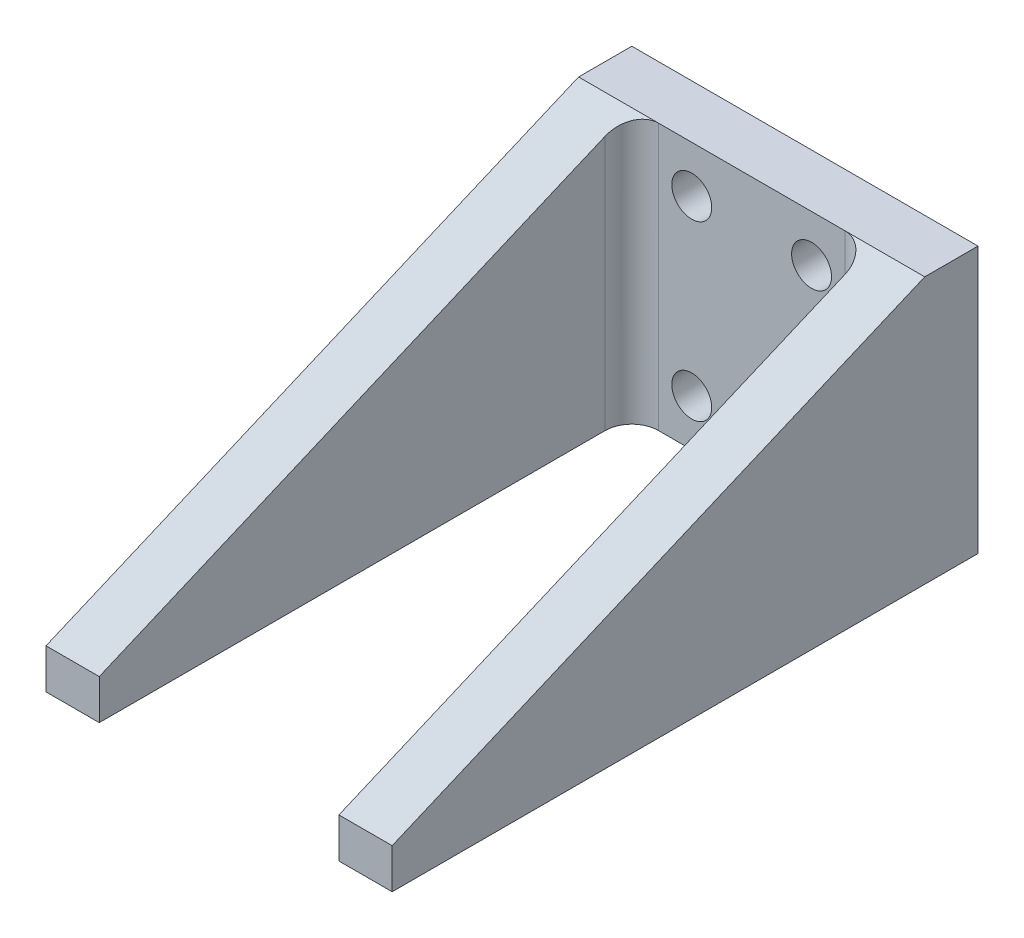
ISO-10303-21;
HEADER;
FILE_DESCRIPTION(('STEP AP214'),'2;1');
FILE_NAME('part.step','',(''),(''),'','','');
FILE_SCHEMA(('AUTOMOTIVE_DESIGN { 1 0 10303 214 1 1 1 1 }'));
ENDSEC;
DATA;
#1=APPLICATION_CONTEXT('core data for automotive mechanical design processes');
#2=APPLICATION_PROTOCOL_DEFINITION('international standard','automotive_design',2000,#1);
#3=PRODUCT_CONTEXT('',#1,'mechanical');
#4=PRODUCT('Part','Part','',(#3));
#5=PRODUCT_RELATED_PRODUCT_CATEGORY('part','',(#4));
#6=PRODUCT_DEFINITION_FORMATION('','',#4);
#7=PRODUCT_DEFINITION_CONTEXT('part definition',#1,'design');
#8=PRODUCT_DEFINITION('design','',#6,#7);
#9=PRODUCT_DEFINITION_SHAPE('','',#8);
#10=(LENGTH_UNIT() NAMED_UNIT(*) SI_UNIT(.MILLI.,.METRE.));
#11=(NAMED_UNIT(*) PLANE_ANGLE_UNIT() SI_UNIT($,.RADIAN.));
#12=(NAMED_UNIT(*) SI_UNIT($,.STERADIAN.) SOLID_ANGLE_UNIT());
#13=UNCERTAINTY_MEASURE_WITH_UNIT(LENGTH_MEASURE(1.E-05),#10,'distance_accuracy_value','');
#14=(GEOMETRIC_REPRESENTATION_CONTEXT(3) GLOBAL_UNCERTAINTY_ASSIGNED_CONTEXT((#13)) GLOBAL_UNIT_ASSIGNED_CONTEXT((#10,
#11,#12)) REPRESENTATION_CONTEXT('',''));
#15=CARTESIAN_POINT('',(0.,0.,0.));
#16=DIRECTION('',(0.,0.,1.));
#17=DIRECTION('',(1.,0.,0.));
#18=AXIS2_PLACEMENT_3D('',#15,#16,#17);
#19=CARTESIAN_POINT('',(0.,0.,4.));
#20=DIRECTION('',(0.,0.,-1.));
#21=DIRECTION('',(-1.,0.,0.));
#22=AXIS2_PLACEMENT_3D('',#19,#20,#21);
#23=PLANE('',#22);
#24=CARTESIAN_POINT('',(-4.5,-6.5,4.));
#25=DIRECTION('',(0.,0.,1.));
#26=DIRECTION('',(1.,0.,0.));
#27=AXIS2_PLACEMENT_3D('',#24,#25,#26);
#28=CIRCLE('',#27,1.5);
#29=CARTESIAN_POINT('',(-3.,-6.5,4.));
#30=VERTEX_POINT('',#29);
#31=EDGE_CURVE('E204',#30,#30,#28,.T.);
#32=ORIENTED_EDGE('',*,*,#31,.F.);
#33=EDGE_LOOP('',(#32));
#34=FACE_BOUND('',#33,.T.);
#35=CARTESIAN_POINT('',(4.5,-6.5,4.));
#36=DIRECTION('',(0.,0.,1.));
#37=DIRECTION('',(1.,0.,0.));
#38=AXIS2_PLACEMENT_3D('',#35,#36,#37);
#39=CIRCLE('',#38,1.5);
#40=CARTESIAN_POINT('',(6.,-6.5,4.));
#41=VERTEX_POINT('',#40);
#42=EDGE_CURVE('E211',#41,#41,#39,.T.);
#43=ORIENTED_EDGE('',*,*,#42,.F.);
#44=EDGE_LOOP('',(#43));
#45=FACE_BOUND('',#44,.T.);
#46=CARTESIAN_POINT('',(4.5,6.5,4.));
#47=DIRECTION('',(0.,0.,1.));
#48=DIRECTION('',(1.,0.,0.));
#49=AXIS2_PLACEMENT_3D('',#46,#47,#48);
#50=CIRCLE('',#49,1.5);
#51=CARTESIAN_POINT('',(6.,6.5,4.));
#52=VERTEX_POINT('',#51);
#53=EDGE_CURVE('E208',#52,#52,#50,.T.);
#54=ORIENTED_EDGE('',*,*,#53,.F.);
#55=EDGE_LOOP('',(#54));
#56=FACE_BOUND('',#55,.T.);
#57=CARTESIAN_POINT('',(-4.5,6.5,4.));
#58=DIRECTION('',(0.,0.,1.));
#59=DIRECTION('',(1.,0.,0.));
#60=AXIS2_PLACEMENT_3D('',#57,#58,#59);
#61=CIRCLE('',#60,1.5);
#62=CARTESIAN_POINT('',(-3.,6.5,4.));
#63=VERTEX_POINT('',#62);
#64=EDGE_CURVE('E151',#63,#63,#61,.T.);
#65=ORIENTED_EDGE('',*,*,#64,.F.);
#66=EDGE_LOOP('',(#65));
#67=FACE_BOUND('',#66,.T.);
#68=DIRECTION('',(-1.,0.,0.));
#69=VECTOR('',#68,1.);
#70=CARTESIAN_POINT('',(-13.,10.,4.));
#71=LINE('',#70,#69);
#72=CARTESIAN_POINT('',(6.99999999999999,10.,4.));
#73=VERTEX_POINT('',#72);
#74=CARTESIAN_POINT('',(-7.,10.,4.));
#75=VERTEX_POINT('',#74);
#76=EDGE_CURVE('E190',#73,#75,#71,.T.);
#77=ORIENTED_EDGE('',*,*,#76,.T.);
#78=DIRECTION('',(0.,1.,0.));
#79=VECTOR('',#78,1.);
#80=CARTESIAN_POINT('',(-6.99999999999999,-10.,4.));
#81=LINE('',#80,#79);
#82=CARTESIAN_POINT('',(-7.,-10.,4.));
#83=VERTEX_POINT('',#82);
#84=EDGE_CURVE('E169',#75,#83,#81,.F.);
#85=ORIENTED_EDGE('',*,*,#84,.T.);
#86=DIRECTION('',(1.,0.,0.));
#87=VECTOR('',#86,1.);
#88=CARTESIAN_POINT('',(-13.,-10.,4.));
#89=LINE('',#88,#87);
#90=CARTESIAN_POINT('',(7.,-10.,4.));
#91=VERTEX_POINT('',#90);
#92=EDGE_CURVE('E181',#83,#91,#89,.T.);
#93=ORIENTED_EDGE('',*,*,#92,.T.);
#94=DIRECTION('',(0.,-1.,0.));
#95=VECTOR('',#94,1.);
#96=CARTESIAN_POINT('',(7.,10.,4.));
#97=LINE('',#96,#95);
#98=EDGE_CURVE('E166',#91,#73,#97,.F.);
#99=ORIENTED_EDGE('',*,*,#98,.T.);
#100=EDGE_LOOP('',(#77,#85,#93,#99));
#101=FACE_BOUND('',#100,.T.);
#102=ADVANCED_FACE('F35',(#34,#45,#56,#67,#101),#23,.F.);
#103=CARTESIAN_POINT('',(13.,-10.,4.));
#104=DIRECTION('',(-1.,0.,0.));
#105=DIRECTION('',(0.,0.,1.));
#106=AXIS2_PLACEMENT_3D('',#103,#104,#105);
#107=PLANE('',#106);
#108=DIRECTION('',(0.,0.,-1.));
#109=VECTOR('',#108,1.);
#110=CARTESIAN_POINT('',(13.,10.,4.));
#111=LINE('',#110,#109);
#112=CARTESIAN_POINT('',(13.,10.,4.));
#113=VERTEX_POINT('',#112);
#114=CARTESIAN_POINT('',(13.,10.,0.));
#115=VERTEX_POINT('',#114);
#116=EDGE_CURVE('E137',#113,#115,#111,.T.);
#117=ORIENTED_EDGE('',*,*,#116,.F.);
#118=DIRECTION('',(0.,0.391140640344852,-0.920330918458474));
#119=VECTOR('',#118,1.);
#120=CARTESIAN_POINT('',(13.,-7.,44.));
#121=LINE('',#120,#119);
#122=CARTESIAN_POINT('',(13.,-7.,44.));
#123=VERTEX_POINT('',#122);
#124=EDGE_CURVE('E131',#123,#113,#121,.T.);
#125=ORIENTED_EDGE('',*,*,#124,.F.);
#126=DIRECTION('',(0.,1.,0.));
#127=VECTOR('',#126,1.);
#128=CARTESIAN_POINT('',(13.,10.,44.));
#129=LINE('',#128,#127);
#130=CARTESIAN_POINT('',(13.,-10.,44.));
#131=VERTEX_POINT('',#130);
#132=EDGE_CURVE('E160',#131,#123,#129,.T.);
#133=ORIENTED_EDGE('',*,*,#132,.F.);
#134=DIRECTION('',(0.,0.,-1.));
#135=VECTOR('',#134,1.);
#136=CARTESIAN_POINT('',(13.,-10.,4.));
#137=LINE('',#136,#135);
#138=CARTESIAN_POINT('',(13.,-10.,0.));
#139=VERTEX_POINT('',#138);
#140=EDGE_CURVE('E143',#131,#139,#137,.T.);
#141=ORIENTED_EDGE('',*,*,#140,.T.);
#142=DIRECTION('',(0.,1.,0.));
#143=VECTOR('',#142,1.);
#144=CARTESIAN_POINT('',(13.,-10.,0.));
#145=LINE('',#144,#143);
#146=EDGE_CURVE('E234',#139,#115,#145,.T.);
#147=ORIENTED_EDGE('',*,*,#146,.T.);
#148=EDGE_LOOP('',(#117,#125,#133,#141,#147));
#149=FACE_BOUND('',#148,.T.);
#150=ADVANCED_FACE('F247',(#149),#107,.F.);
#151=CARTESIAN_POINT('',(-13.,10.,4.));
#152=DIRECTION('',(0.,-1.,0.));
#153=DIRECTION('',(0.,0.,-1.));
#154=AXIS2_PLACEMENT_3D('',#151,#152,#153);
#155=PLANE('',#154);
#156=DIRECTION('',(0.,0.,-1.));
#157=VECTOR('',#156,1.);
#158=CARTESIAN_POINT('',(-13.,10.,4.));
#159=LINE('',#158,#157);
#160=CARTESIAN_POINT('',(-13.,10.,4.));
#161=VERTEX_POINT('',#160);
#162=CARTESIAN_POINT('',(-13.,10.,0.));
#163=VERTEX_POINT('',#162);
#164=EDGE_CURVE('E126',#161,#163,#159,.T.);
#165=ORIENTED_EDGE('',*,*,#164,.F.);
#166=DIRECTION('',(1.,0.,0.));
#167=VECTOR('',#166,1.);
#168=CARTESIAN_POINT('',(-13.,10.,4.));
#169=LINE('',#168,#167);
#170=EDGE_CURVE('E51',#161,#75,#169,.T.);
#171=ORIENTED_EDGE('',*,*,#170,.T.);
#172=ORIENTED_EDGE('',*,*,#76,.F.);
#173=EDGE_CURVE('E121',#73,#113,#169,.T.);
#174=ORIENTED_EDGE('',*,*,#173,.T.);
#175=ORIENTED_EDGE('',*,*,#116,.T.);
#176=DIRECTION('',(-1.,0.,0.));
#177=VECTOR('',#176,1.);
#178=CARTESIAN_POINT('',(-13.,10.,0.));
#179=LINE('',#178,#177);
#180=EDGE_CURVE('E135',#115,#163,#179,.T.);
#181=ORIENTED_EDGE('',*,*,#180,.T.);
#182=EDGE_LOOP('',(#165,#171,#172,#174,#175,#181));
#183=FACE_BOUND('',#182,.T.);
#184=ADVANCED_FACE('F133',(#183),#155,.F.);
#185=CARTESIAN_POINT('',(-13.,-10.,4.));
#186=DIRECTION('',(1.,0.,0.));
#187=DIRECTION('',(0.,0.,-1.));
#188=AXIS2_PLACEMENT_3D('',#185,#186,#187);
#189=PLANE('',#188);
#190=DIRECTION('',(0.,-1.,0.));
#191=VECTOR('',#190,1.);
#192=CARTESIAN_POINT('',(-13.,10.,44.));
#193=LINE('',#192,#191);
#194=CARTESIAN_POINT('',(-13.,-7.,44.));
#195=VERTEX_POINT('',#194);
#196=CARTESIAN_POINT('',(-13.,-10.,44.));
#197=VERTEX_POINT('',#196);
#198=EDGE_CURVE('E129',#195,#197,#193,.T.);
#199=ORIENTED_EDGE('',*,*,#198,.F.);
#200=DIRECTION('',(0.,0.391140640344852,-0.920330918458474));
#201=VECTOR('',#200,1.);
#202=CARTESIAN_POINT('',(-13.,-7.,44.));
#203=LINE('',#202,#201);
#204=EDGE_CURVE('E115',#195,#161,#203,.T.);
#205=ORIENTED_EDGE('',*,*,#204,.T.);
#206=ORIENTED_EDGE('',*,*,#164,.T.);
#207=DIRECTION('',(0.,-1.,0.));
#208=VECTOR('',#207,1.);
#209=CARTESIAN_POINT('',(-13.,-10.,0.));
#210=LINE('',#209,#208);
#211=CARTESIAN_POINT('',(-13.,-10.,0.));
#212=VERTEX_POINT('',#211);
#213=EDGE_CURVE('E240',#163,#212,#210,.T.);
#214=ORIENTED_EDGE('',*,*,#213,.T.);
#215=DIRECTION('',(0.,0.,-1.));
#216=VECTOR('',#215,1.);
#217=CARTESIAN_POINT('',(-13.,-10.,4.));
#218=LINE('',#217,#216);
#219=EDGE_CURVE('E138',#197,#212,#218,.T.);
#220=ORIENTED_EDGE('',*,*,#219,.F.);
#221=EDGE_LOOP('',(#199,#205,#206,#214,#220));
#222=FACE_BOUND('',#221,.T.);
#223=ADVANCED_FACE('F125',(#222),#189,.F.);
#224=CARTESIAN_POINT('',(-13.,-10.,4.));
#225=DIRECTION('',(0.,1.,0.));
#226=DIRECTION('',(0.,0.,1.));
#227=AXIS2_PLACEMENT_3D('',#224,#225,#226);
#228=PLANE('',#227);
#229=DIRECTION('',(1.,0.,0.));
#230=VECTOR('',#229,1.);
#231=CARTESIAN_POINT('',(-13.,-10.,0.));
#232=LINE('',#231,#230);
#233=EDGE_CURVE('E235',#212,#139,#232,.T.);
#234=ORIENTED_EDGE('',*,*,#233,.T.);
#235=ORIENTED_EDGE('',*,*,#140,.F.);
#236=DIRECTION('',(1.,0.,0.));
#237=VECTOR('',#236,1.);
#238=CARTESIAN_POINT('',(13.,-10.,44.));
#239=LINE('',#238,#237);
#240=CARTESIAN_POINT('',(9.00000000000001,-10.,44.));
#241=VERTEX_POINT('',#240);
#242=EDGE_CURVE('E221',#241,#131,#239,.T.);
#243=ORIENTED_EDGE('',*,*,#242,.F.);
#244=DIRECTION('',(0.,0.,-1.));
#245=VECTOR('',#244,1.);
#246=CARTESIAN_POINT('',(9.00000000000001,-10.,44.));
#247=LINE('',#246,#245);
#248=CARTESIAN_POINT('',(9.00000000000001,-10.,6.));
#249=VERTEX_POINT('',#248);
#250=EDGE_CURVE('E185',#241,#249,#247,.T.);
#251=ORIENTED_EDGE('',*,*,#250,.T.);
#252=CARTESIAN_POINT('',(7.,-9.99999999999999,6.));
#253=DIRECTION('',(0.,1.,0.));
#254=DIRECTION('',(0.,0.,1.));
#255=AXIS2_PLACEMENT_3D('',#252,#253,#254);
#256=CIRCLE('',#255,2.);
#257=EDGE_CURVE('E44',#249,#91,#256,.T.);
#258=ORIENTED_EDGE('',*,*,#257,.T.);
#259=ORIENTED_EDGE('',*,*,#92,.F.);
#260=CARTESIAN_POINT('',(-6.99999999999999,-10.,6.));
#261=DIRECTION('',(0.,1.,0.));
#262=DIRECTION('',(0.,0.,1.));
#263=AXIS2_PLACEMENT_3D('',#260,#261,#262);
#264=CIRCLE('',#263,2.);
#265=CARTESIAN_POINT('',(-8.99999999999999,-10.,6.));
#266=VERTEX_POINT('',#265);
#267=EDGE_CURVE('E175',#83,#266,#264,.T.);
#268=ORIENTED_EDGE('',*,*,#267,.T.);
#269=DIRECTION('',(0.,0.,-1.));
#270=VECTOR('',#269,1.);
#271=CARTESIAN_POINT('',(-8.99999999999999,-10.,44.));
#272=LINE('',#271,#270);
#273=CARTESIAN_POINT('',(-8.99999999999999,-10.,44.));
#274=VERTEX_POINT('',#273);
#275=EDGE_CURVE('E231',#274,#266,#272,.T.);
#276=ORIENTED_EDGE('',*,*,#275,.F.);
#277=DIRECTION('',(1.,0.,0.));
#278=VECTOR('',#277,1.);
#279=CARTESIAN_POINT('',(-13.,-10.,44.));
#280=LINE('',#279,#278);
#281=EDGE_CURVE('E226',#197,#274,#280,.T.);
#282=ORIENTED_EDGE('',*,*,#281,.F.);
#283=ORIENTED_EDGE('',*,*,#219,.T.);
#284=EDGE_LOOP('',(#234,#235,#243,#251,#258,#259,#268,#276,#282,#283));
#285=FACE_BOUND('',#284,.T.);
#286=ADVANCED_FACE('F180',(#285),#228,.F.);
#287=CARTESIAN_POINT('',(0.,0.,0.));
#288=DIRECTION('',(0.,0.,-1.));
#289=DIRECTION('',(-1.,0.,0.));
#290=AXIS2_PLACEMENT_3D('',#287,#288,#289);
#291=PLANE('',#290);
#292=CARTESIAN_POINT('',(-4.5,-6.5,0.));
#293=DIRECTION('',(0.,0.,-1.));
#294=DIRECTION('',(-1.,0.,0.));
#295=AXIS2_PLACEMENT_3D('',#292,#293,#294);
#296=CIRCLE('',#295,1.5);
#297=CARTESIAN_POINT('',(-6.,-6.5,0.));
#298=VERTEX_POINT('',#297);
#299=EDGE_CURVE('E157',#298,#298,#296,.T.);
#300=ORIENTED_EDGE('',*,*,#299,.F.);
#301=EDGE_LOOP('',(#300));
#302=FACE_BOUND('',#301,.T.);
#303=CARTESIAN_POINT('',(4.5,-6.5,0.));
#304=DIRECTION('',(0.,0.,-1.));
#305=DIRECTION('',(-1.,0.,0.));
#306=AXIS2_PLACEMENT_3D('',#303,#304,#305);
#307=CIRCLE('',#306,1.5);
#308=CARTESIAN_POINT('',(3.,-6.5,0.));
#309=VERTEX_POINT('',#308);
#310=EDGE_CURVE('E154',#309,#309,#307,.T.);
#311=ORIENTED_EDGE('',*,*,#310,.F.);
#312=EDGE_LOOP('',(#311));
#313=FACE_BOUND('',#312,.T.);
#314=CARTESIAN_POINT('',(4.5,6.5,0.));
#315=DIRECTION('',(0.,0.,-1.));
#316=DIRECTION('',(-1.,0.,0.));
#317=AXIS2_PLACEMENT_3D('',#314,#315,#316);
#318=CIRCLE('',#317,1.5);
#319=CARTESIAN_POINT('',(3.,6.5,0.));
#320=VERTEX_POINT('',#319);
#321=EDGE_CURVE('E150',#320,#320,#318,.T.);
#322=ORIENTED_EDGE('',*,*,#321,.F.);
#323=EDGE_LOOP('',(#322));
#324=FACE_BOUND('',#323,.T.);
#325=CARTESIAN_POINT('',(-4.5,6.5,0.));
#326=DIRECTION('',(0.,0.,-1.));
#327=DIRECTION('',(-1.,0.,0.));
#328=AXIS2_PLACEMENT_3D('',#325,#326,#327);
#329=CIRCLE('',#328,1.5);
#330=CARTESIAN_POINT('',(-6.,6.5,0.));
#331=VERTEX_POINT('',#330);
#332=EDGE_CURVE('E147',#331,#331,#329,.T.);
#333=ORIENTED_EDGE('',*,*,#332,.F.);
#334=EDGE_LOOP('',(#333));
#335=FACE_BOUND('',#334,.T.);
#336=ORIENTED_EDGE('',*,*,#146,.F.);
#337=ORIENTED_EDGE('',*,*,#233,.F.);
#338=ORIENTED_EDGE('',*,*,#213,.F.);
#339=ORIENTED_EDGE('',*,*,#180,.F.);
#340=EDGE_LOOP('',(#336,#337,#338,#339));
#341=FACE_BOUND('',#340,.T.);
#342=ADVANCED_FACE('F251',(#302,#313,#324,#335,#341),#291,.T.);
#343=CARTESIAN_POINT('',(-9.,10.,44.));
#344=DIRECTION('',(-1.,0.,0.));
#345=DIRECTION('',(0.,-1.,0.));
#346=AXIS2_PLACEMENT_3D('',#343,#344,#345);
#347=PLANE('',#346);
#348=ORIENTED_EDGE('',*,*,#275,.T.);
#349=DIRECTION('',(0.,1.,0.));
#350=VECTOR('',#349,1.);
#351=CARTESIAN_POINT('',(-9.,10.,6.));
#352=LINE('',#351,#350);
#353=CARTESIAN_POINT('',(-9.,9.15000000000001,6.));
#354=VERTEX_POINT('',#353);
#355=EDGE_CURVE('E163',#266,#354,#352,.T.);
#356=ORIENTED_EDGE('',*,*,#355,.T.);
#357=DIRECTION('',(0.,-0.391140640344852,0.920330918458474));
#358=VECTOR('',#357,1.);
#359=CARTESIAN_POINT('',(-9.,-4.39915299100052,37.8803599788248));
#360=LINE('',#359,#358);
#361=CARTESIAN_POINT('',(-9.,-7.,44.));
#362=VERTEX_POINT('',#361);
#363=EDGE_CURVE('E202',#354,#362,#360,.T.);
#364=ORIENTED_EDGE('',*,*,#363,.T.);
#365=DIRECTION('',(0.,1.,0.));
#366=VECTOR('',#365,1.);
#367=CARTESIAN_POINT('',(-9.,10.,44.));
#368=LINE('',#367,#366);
#369=EDGE_CURVE('E228',#274,#362,#368,.T.);
#370=ORIENTED_EDGE('',*,*,#369,.F.);
#371=EDGE_LOOP('',(#348,#356,#364,#370));
#372=FACE_BOUND('',#371,.T.);
#373=ADVANCED_FACE('F282',(#372),#347,.F.);
#374=CARTESIAN_POINT('',(0.,0.,44.));
#375=DIRECTION('',(0.,0.,1.));
#376=DIRECTION('',(1.,0.,0.));
#377=AXIS2_PLACEMENT_3D('',#374,#375,#376);
#378=PLANE('',#377);
#379=DIRECTION('',(1.,0.,0.));
#380=VECTOR('',#379,1.);
#381=CARTESIAN_POINT('',(-13.,-7.,44.));
#382=LINE('',#381,#380);
#383=EDGE_CURVE('E130',#195,#362,#382,.T.);
#384=ORIENTED_EDGE('',*,*,#383,.F.);
#385=ORIENTED_EDGE('',*,*,#198,.T.);
#386=ORIENTED_EDGE('',*,*,#281,.T.);
#387=ORIENTED_EDGE('',*,*,#369,.T.);
#388=EDGE_LOOP('',(#384,#385,#386,#387));
#389=FACE_BOUND('',#388,.T.);
#390=ADVANCED_FACE('F256',(#389),#378,.T.);
#391=CARTESIAN_POINT('',(9.,10.,44.));
#392=DIRECTION('',(1.,0.,0.));
#393=DIRECTION('',(0.,1.,0.));
#394=AXIS2_PLACEMENT_3D('',#391,#392,#393);
#395=PLANE('',#394);
#396=DIRECTION('',(0.,0.391140640344852,-0.920330918458474));
#397=VECTOR('',#396,1.);
#398=CARTESIAN_POINT('',(9.,-4.39915299100052,37.8803599788248));
#399=LINE('',#398,#397);
#400=CARTESIAN_POINT('',(9.00000000000001,-7.,44.));
#401=VERTEX_POINT('',#400);
#402=CARTESIAN_POINT('',(9.,9.15000000000001,6.));
#403=VERTEX_POINT('',#402);
#404=EDGE_CURVE('E120',#401,#403,#399,.T.);
#405=ORIENTED_EDGE('',*,*,#404,.T.);
#406=DIRECTION('',(0.,-1.,0.));
#407=VECTOR('',#406,1.);
#408=CARTESIAN_POINT('',(9.00000000000001,-9.99999999999999,6.));
#409=LINE('',#408,#407);
#410=EDGE_CURVE('E171',#403,#249,#409,.T.);
#411=ORIENTED_EDGE('',*,*,#410,.T.);
#412=ORIENTED_EDGE('',*,*,#250,.F.);
#413=DIRECTION('',(0.,-1.,0.));
#414=VECTOR('',#413,1.);
#415=CARTESIAN_POINT('',(9.,10.,44.));
#416=LINE('',#415,#414);
#417=EDGE_CURVE('E201',#401,#241,#416,.T.);
#418=ORIENTED_EDGE('',*,*,#417,.F.);
#419=EDGE_LOOP('',(#405,#411,#412,#418));
#420=FACE_BOUND('',#419,.T.);
#421=ADVANCED_FACE('F200',(#420),#395,.F.);
#422=CARTESIAN_POINT('',(0.,0.,44.));
#423=DIRECTION('',(0.,0.,-1.));
#424=DIRECTION('',(-1.,0.,0.));
#425=AXIS2_PLACEMENT_3D('',#422,#423,#424);
#426=PLANE('',#425);
#427=ORIENTED_EDGE('',*,*,#132,.T.);
#428=DIRECTION('',(-1.,0.,0.));
#429=VECTOR('',#428,1.);
#430=CARTESIAN_POINT('',(0.,-7.,44.));
#431=LINE('',#430,#429);
#432=EDGE_CURVE('E140',#123,#401,#431,.T.);
#433=ORIENTED_EDGE('',*,*,#432,.T.);
#434=ORIENTED_EDGE('',*,*,#417,.T.);
#435=ORIENTED_EDGE('',*,*,#242,.T.);
#436=EDGE_LOOP('',(#427,#433,#434,#435));
#437=FACE_BOUND('',#436,.T.);
#438=ADVANCED_FACE('F259',(#437),#426,.F.);
#439=CARTESIAN_POINT('',(-4.5,6.5,-26.));
#440=DIRECTION('',(0.,0.,1.));
#441=DIRECTION('',(1.,0.,0.));
#442=AXIS2_PLACEMENT_3D('',#439,#440,#441);
#443=CYLINDRICAL_SURFACE('',#442,1.5);
#444=ORIENTED_EDGE('',*,*,#332,.T.);
#445=EDGE_LOOP('',(#444));
#446=FACE_BOUND('',#445,.T.);
#447=ORIENTED_EDGE('',*,*,#64,.T.);
#448=EDGE_LOOP('',(#447));
#449=FACE_BOUND('',#448,.T.);
#450=ADVANCED_FACE('F261',(#446,#449),#443,.F.);
#451=CARTESIAN_POINT('',(4.5,6.5,-26.));
#452=DIRECTION('',(0.,0.,1.));
#453=DIRECTION('',(1.,0.,0.));
#454=AXIS2_PLACEMENT_3D('',#451,#452,#453);
#455=CYLINDRICAL_SURFACE('',#454,1.5);
#456=ORIENTED_EDGE('',*,*,#321,.T.);
#457=EDGE_LOOP('',(#456));
#458=FACE_BOUND('',#457,.T.);
#459=ORIENTED_EDGE('',*,*,#53,.T.);
#460=EDGE_LOOP('',(#459));
#461=FACE_BOUND('',#460,.T.);
#462=ADVANCED_FACE('F267',(#458,#461),#455,.F.);
#463=CARTESIAN_POINT('',(4.5,-6.5,-26.));
#464=DIRECTION('',(0.,0.,1.));
#465=DIRECTION('',(1.,0.,0.));
#466=AXIS2_PLACEMENT_3D('',#463,#464,#465);
#467=CYLINDRICAL_SURFACE('',#466,1.5);
#468=ORIENTED_EDGE('',*,*,#310,.T.);
#469=EDGE_LOOP('',(#468));
#470=FACE_BOUND('',#469,.T.);
#471=ORIENTED_EDGE('',*,*,#42,.T.);
#472=EDGE_LOOP('',(#471));
#473=FACE_BOUND('',#472,.T.);
#474=ADVANCED_FACE('F350',(#470,#473),#467,.F.);
#475=CARTESIAN_POINT('',(-4.5,-6.5,-26.));
#476=DIRECTION('',(0.,0.,1.));
#477=DIRECTION('',(1.,0.,0.));
#478=AXIS2_PLACEMENT_3D('',#475,#476,#477);
#479=CYLINDRICAL_SURFACE('',#478,1.5);
#480=ORIENTED_EDGE('',*,*,#299,.T.);
#481=EDGE_LOOP('',(#480));
#482=FACE_BOUND('',#481,.T.);
#483=ORIENTED_EDGE('',*,*,#31,.T.);
#484=EDGE_LOOP('',(#483));
#485=FACE_BOUND('',#484,.T.);
#486=ADVANCED_FACE('F326',(#482,#485),#479,.F.);
#487=CARTESIAN_POINT('',(-13.,-7.,44.));
#488=DIRECTION('',(0.,-0.920330918458474,-0.391140640344852));
#489=DIRECTION('',(0.,0.391140640344852,-0.920330918458474));
#490=AXIS2_PLACEMENT_3D('',#487,#488,#489);
#491=PLANE('',#490);
#492=ORIENTED_EDGE('',*,*,#432,.F.);
#493=ORIENTED_EDGE('',*,*,#124,.T.);
#494=ORIENTED_EDGE('',*,*,#173,.F.);
#495=CARTESIAN_POINT('',(7.,9.15000000000001,6.));
#496=DIRECTION('',(0.,-0.920330918458474,-0.391140640344852));
#497=DIRECTION('',(0.,0.391140640344852,-0.920330918458474));
#498=AXIS2_PLACEMENT_3D('',#495,#496,#497);
#499=ELLIPSE('',#498,2.17313138121007,2.);
#500=EDGE_CURVE('E11',#73,#403,#499,.T.);
#501=ORIENTED_EDGE('',*,*,#500,.T.);
#502=ORIENTED_EDGE('',*,*,#404,.F.);
#503=EDGE_LOOP('',(#492,#493,#494,#501,#502));
#504=FACE_BOUND('',#503,.T.);
#505=ADVANCED_FACE('F196',(#504),#491,.F.);
#506=ORIENTED_EDGE('',*,*,#170,.F.);
#507=ORIENTED_EDGE('',*,*,#204,.F.);
#508=ORIENTED_EDGE('',*,*,#383,.T.);
#509=ORIENTED_EDGE('',*,*,#363,.F.);
#510=CARTESIAN_POINT('',(-7.,9.15000000000001,6.));
#511=DIRECTION('',(0.,-0.920330918458474,-0.391140640344852));
#512=DIRECTION('',(0.,-0.391140640344852,0.920330918458474));
#513=AXIS2_PLACEMENT_3D('',#510,#511,#512);
#514=ELLIPSE('',#513,2.17313138121007,2.);
#515=EDGE_CURVE('E118',#354,#75,#514,.T.);
#516=ORIENTED_EDGE('',*,*,#515,.T.);
#517=EDGE_LOOP('',(#506,#507,#508,#509,#516));
#518=FACE_BOUND('',#517,.T.);
#519=ADVANCED_FACE('F113',(#518),#491,.F.);
#520=CARTESIAN_POINT('',(-7.,10.,6.));
#521=DIRECTION('',(0.,-1.,0.));
#522=DIRECTION('',(1.,0.,0.));
#523=AXIS2_PLACEMENT_3D('',#520,#521,#522);
#524=CYLINDRICAL_SURFACE('',#523,2.);
#525=ORIENTED_EDGE('',*,*,#267,.F.);
#526=ORIENTED_EDGE('',*,*,#84,.F.);
#527=ORIENTED_EDGE('',*,*,#515,.F.);
#528=ORIENTED_EDGE('',*,*,#355,.F.);
#529=EDGE_LOOP('',(#525,#526,#527,#528));
#530=FACE_BOUND('',#529,.T.);
#531=ADVANCED_FACE('F292',(#530),#524,.F.);
#532=CARTESIAN_POINT('',(7.,10.,6.));
#533=DIRECTION('',(0.,1.,0.));
#534=DIRECTION('',(-1.,0.,0.));
#535=AXIS2_PLACEMENT_3D('',#532,#533,#534);
#536=CYLINDRICAL_SURFACE('',#535,2.);
#537=ORIENTED_EDGE('',*,*,#500,.F.);
#538=ORIENTED_EDGE('',*,*,#98,.F.);
#539=ORIENTED_EDGE('',*,*,#257,.F.);
#540=ORIENTED_EDGE('',*,*,#410,.F.);
#541=EDGE_LOOP('',(#537,#538,#539,#540));
#542=FACE_BOUND('',#541,.T.);
#543=ADVANCED_FACE('F37',(#542),#536,.F.);
#544=CLOSED_SHELL('',(#102,#150,#184,#223,#286,#342,#373,#390,#421,#438,#450,#462,#474,#486,
#505,#519,#531,#543));
#545=MANIFOLD_SOLID_BREP('B2',#544);
#546=ADVANCED_BREP_SHAPE_REPRESENTATION('',(#18,#545),#14);
#547=SHAPE_DEFINITION_REPRESENTATION(#9,#546);
ENDSEC;
END-ISO-10303-21;
